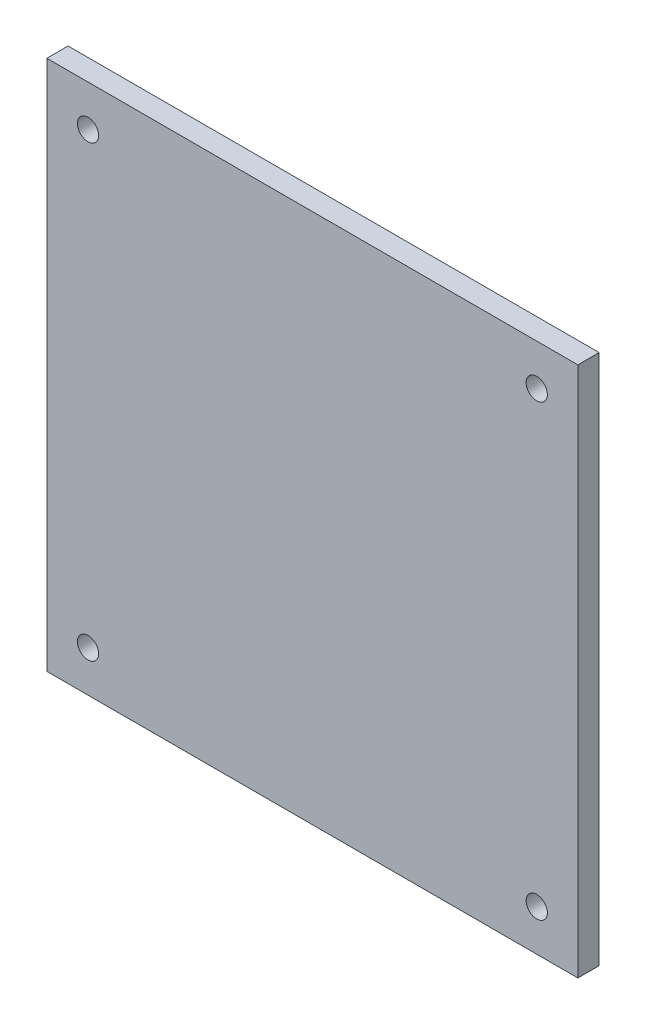
ISO-10303-21;
HEADER;
FILE_DESCRIPTION(('STEP AP214'),'2;1');
FILE_NAME('part.step','',(''),(''),'','','');
FILE_SCHEMA(('AUTOMOTIVE_DESIGN { 1 0 10303 214 1 1 1 1 }'));
ENDSEC;
DATA;
#1=APPLICATION_CONTEXT('core data for automotive mechanical design processes');
#2=APPLICATION_PROTOCOL_DEFINITION('international standard','automotive_design',2000,#1);
#3=PRODUCT_CONTEXT('',#1,'mechanical');
#4=PRODUCT('Part','Part','',(#3));
#5=PRODUCT_RELATED_PRODUCT_CATEGORY('part','',(#4));
#6=PRODUCT_DEFINITION_FORMATION('','',#4);
#7=PRODUCT_DEFINITION_CONTEXT('part definition',#1,'design');
#8=PRODUCT_DEFINITION('design','',#6,#7);
#9=PRODUCT_DEFINITION_SHAPE('','',#8);
#10=(LENGTH_UNIT() NAMED_UNIT(*) SI_UNIT(.MILLI.,.METRE.));
#11=(NAMED_UNIT(*) PLANE_ANGLE_UNIT() SI_UNIT($,.RADIAN.));
#12=(NAMED_UNIT(*) SI_UNIT($,.STERADIAN.) SOLID_ANGLE_UNIT());
#13=UNCERTAINTY_MEASURE_WITH_UNIT(LENGTH_MEASURE(1.E-05),#10,'distance_accuracy_value','');
#14=(GEOMETRIC_REPRESENTATION_CONTEXT(3) GLOBAL_UNCERTAINTY_ASSIGNED_CONTEXT((#13)) GLOBAL_UNIT_ASSIGNED_CONTEXT((#10,
#11,#12)) REPRESENTATION_CONTEXT('',''));
#15=CARTESIAN_POINT('',(0.,0.,0.));
#16=DIRECTION('',(0.,0.,1.));
#17=DIRECTION('',(1.,0.,0.));
#18=AXIS2_PLACEMENT_3D('',#15,#16,#17);
#19=CARTESIAN_POINT('',(105.866052122331,1.22834426278652,-4.));
#20=DIRECTION('',(-1.,0.,0.));
#21=DIRECTION('',(0.,0.,1.));
#22=AXIS2_PLACEMENT_3D('',#19,#20,#21);
#23=PLANE('',#22);
#24=DIRECTION('',(0.,-1.,0.));
#25=VECTOR('',#24,1.);
#26=CARTESIAN_POINT('',(105.866052122331,1.22834426278652,0.));
#27=LINE('',#26,#25);
#28=CARTESIAN_POINT('',(105.866052122331,101.228344262787,0.));
#29=VERTEX_POINT('',#28);
#30=CARTESIAN_POINT('',(105.866052122331,1.22834426278652,0.));
#31=VERTEX_POINT('',#30);
#32=EDGE_CURVE('E107',#29,#31,#27,.T.);
#33=ORIENTED_EDGE('',*,*,#32,.F.);
#34=DIRECTION('',(0.,0.,1.));
#35=VECTOR('',#34,1.);
#36=CARTESIAN_POINT('',(105.866052122331,101.228344262787,-4.));
#37=LINE('',#36,#35);
#38=CARTESIAN_POINT('',(105.866052122331,101.228344262787,-4.));
#39=VERTEX_POINT('',#38);
#40=EDGE_CURVE('E11',#39,#29,#37,.T.);
#41=ORIENTED_EDGE('',*,*,#40,.F.);
#42=DIRECTION('',(0.,-1.,0.));
#43=VECTOR('',#42,1.);
#44=CARTESIAN_POINT('',(105.866052122331,1.22834426278652,-4.));
#45=LINE('',#44,#43);
#46=CARTESIAN_POINT('',(105.866052122331,1.22834426278652,-4.));
#47=VERTEX_POINT('',#46);
#48=EDGE_CURVE('E100',#39,#47,#45,.T.);
#49=ORIENTED_EDGE('',*,*,#48,.T.);
#50=DIRECTION('',(0.,0.,1.));
#51=VECTOR('',#50,1.);
#52=CARTESIAN_POINT('',(105.866052122331,1.22834426278652,-4.));
#53=LINE('',#52,#51);
#54=EDGE_CURVE('E45',#47,#31,#53,.T.);
#55=ORIENTED_EDGE('',*,*,#54,.T.);
#56=EDGE_LOOP('',(#33,#41,#49,#55));
#57=FACE_BOUND('',#56,.T.);
#58=ADVANCED_FACE('F42',(#57),#23,.T.);
#59=CARTESIAN_POINT('',(105.866052122331,101.228344262787,-4.));
#60=DIRECTION('',(0.,1.,0.));
#61=DIRECTION('',(0.,0.,1.));
#62=AXIS2_PLACEMENT_3D('',#59,#60,#61);
#63=PLANE('',#62);
#64=DIRECTION('',(-1.,0.,0.));
#65=VECTOR('',#64,1.);
#66=CARTESIAN_POINT('',(105.866052122331,101.228344262787,0.));
#67=LINE('',#66,#65);
#68=CARTESIAN_POINT('',(205.866052122331,101.228344262787,0.));
#69=VERTEX_POINT('',#68);
#70=EDGE_CURVE('E102',#69,#29,#67,.T.);
#71=ORIENTED_EDGE('',*,*,#70,.F.);
#72=DIRECTION('',(0.,0.,1.));
#73=VECTOR('',#72,1.);
#74=CARTESIAN_POINT('',(205.866052122331,101.228344262787,-4.));
#75=LINE('',#74,#73);
#76=CARTESIAN_POINT('',(205.866052122331,101.228344262787,-4.));
#77=VERTEX_POINT('',#76);
#78=EDGE_CURVE('E51',#77,#69,#75,.T.);
#79=ORIENTED_EDGE('',*,*,#78,.F.);
#80=DIRECTION('',(-1.,0.,0.));
#81=VECTOR('',#80,1.);
#82=CARTESIAN_POINT('',(105.866052122331,101.228344262787,-4.));
#83=LINE('',#82,#81);
#84=EDGE_CURVE('E97',#77,#39,#83,.T.);
#85=ORIENTED_EDGE('',*,*,#84,.T.);
#86=ORIENTED_EDGE('',*,*,#40,.T.);
#87=EDGE_LOOP('',(#71,#79,#85,#86));
#88=FACE_BOUND('',#87,.T.);
#89=ADVANCED_FACE('F118',(#88),#63,.T.);
#90=CARTESIAN_POINT('',(205.866052122331,1.22834426278652,-4.));
#91=DIRECTION('',(1.,0.,0.));
#92=DIRECTION('',(0.,0.,-1.));
#93=AXIS2_PLACEMENT_3D('',#90,#91,#92);
#94=PLANE('',#93);
#95=DIRECTION('',(0.,1.,0.));
#96=VECTOR('',#95,1.);
#97=CARTESIAN_POINT('',(205.866052122331,1.22834426278652,0.));
#98=LINE('',#97,#96);
#99=CARTESIAN_POINT('',(205.866052122331,1.22834426278652,0.));
#100=VERTEX_POINT('',#99);
#101=EDGE_CURVE('E92',#100,#69,#98,.T.);
#102=ORIENTED_EDGE('',*,*,#101,.F.);
#103=DIRECTION('',(0.,0.,1.));
#104=VECTOR('',#103,1.);
#105=CARTESIAN_POINT('',(205.866052122331,1.22834426278652,-4.));
#106=LINE('',#105,#104);
#107=CARTESIAN_POINT('',(205.866052122331,1.22834426278652,-4.));
#108=VERTEX_POINT('',#107);
#109=EDGE_CURVE('E87',#108,#100,#106,.T.);
#110=ORIENTED_EDGE('',*,*,#109,.F.);
#111=DIRECTION('',(0.,1.,0.));
#112=VECTOR('',#111,1.);
#113=CARTESIAN_POINT('',(205.866052122331,1.22834426278652,-4.));
#114=LINE('',#113,#112);
#115=EDGE_CURVE('E90',#108,#77,#114,.T.);
#116=ORIENTED_EDGE('',*,*,#115,.T.);
#117=ORIENTED_EDGE('',*,*,#78,.T.);
#118=EDGE_LOOP('',(#102,#110,#116,#117));
#119=FACE_BOUND('',#118,.T.);
#120=ADVANCED_FACE('F89',(#119),#94,.T.);
#121=CARTESIAN_POINT('',(105.866052122331,1.22834426278652,-4.));
#122=DIRECTION('',(0.,-1.,0.));
#123=DIRECTION('',(0.,0.,-1.));
#124=AXIS2_PLACEMENT_3D('',#121,#122,#123);
#125=PLANE('',#124);
#126=DIRECTION('',(1.,0.,0.));
#127=VECTOR('',#126,1.);
#128=CARTESIAN_POINT('',(105.866052122331,1.22834426278652,0.));
#129=LINE('',#128,#127);
#130=EDGE_CURVE('E110',#31,#100,#129,.T.);
#131=ORIENTED_EDGE('',*,*,#130,.F.);
#132=ORIENTED_EDGE('',*,*,#54,.F.);
#133=DIRECTION('',(1.,0.,0.));
#134=VECTOR('',#133,1.);
#135=CARTESIAN_POINT('',(105.866052122331,1.22834426278652,-4.));
#136=LINE('',#135,#134);
#137=EDGE_CURVE('E96',#47,#108,#136,.T.);
#138=ORIENTED_EDGE('',*,*,#137,.T.);
#139=ORIENTED_EDGE('',*,*,#109,.T.);
#140=EDGE_LOOP('',(#131,#132,#138,#139));
#141=FACE_BOUND('',#140,.T.);
#142=ADVANCED_FACE('F99',(#141),#125,.T.);
#143=CARTESIAN_POINT('',(0.,0.,-4.));
#144=DIRECTION('',(0.,0.,-1.));
#145=DIRECTION('',(-1.,0.,0.));
#146=AXIS2_PLACEMENT_3D('',#143,#144,#145);
#147=PLANE('',#146);
#148=CARTESIAN_POINT('',(113.616052122331,8.97834426278652,-4.));
#149=DIRECTION('',(0.,0.,1.));
#150=DIRECTION('',(1.,0.,0.));
#151=AXIS2_PLACEMENT_3D('',#148,#149,#150);
#152=CIRCLE('',#151,2.);
#153=CARTESIAN_POINT('',(115.616052122331,8.97834426278652,-4.));
#154=VERTEX_POINT('',#153);
#155=EDGE_CURVE('E159',#154,#154,#152,.T.);
#156=ORIENTED_EDGE('',*,*,#155,.T.);
#157=EDGE_LOOP('',(#156));
#158=FACE_BOUND('',#157,.T.);
#159=CARTESIAN_POINT('',(198.116052122331,8.97834426278652,-4.));
#160=DIRECTION('',(0.,0.,1.));
#161=DIRECTION('',(1.,0.,0.));
#162=AXIS2_PLACEMENT_3D('',#159,#160,#161);
#163=CIRCLE('',#162,2.);
#164=CARTESIAN_POINT('',(200.116052122331,8.97834426278652,-4.));
#165=VERTEX_POINT('',#164);
#166=EDGE_CURVE('E167',#165,#165,#163,.T.);
#167=ORIENTED_EDGE('',*,*,#166,.T.);
#168=EDGE_LOOP('',(#167));
#169=FACE_BOUND('',#168,.T.);
#170=CARTESIAN_POINT('',(198.116052122331,93.4783442627865,-4.));
#171=DIRECTION('',(0.,0.,1.));
#172=DIRECTION('',(1.,0.,0.));
#173=AXIS2_PLACEMENT_3D('',#170,#171,#172);
#174=CIRCLE('',#173,2.);
#175=CARTESIAN_POINT('',(200.116052122331,93.4783442627865,-4.));
#176=VERTEX_POINT('',#175);
#177=EDGE_CURVE('E173',#176,#176,#174,.T.);
#178=ORIENTED_EDGE('',*,*,#177,.T.);
#179=EDGE_LOOP('',(#178));
#180=FACE_BOUND('',#179,.T.);
#181=CARTESIAN_POINT('',(113.616052122331,93.4783442627865,-4.));
#182=DIRECTION('',(0.,0.,1.));
#183=DIRECTION('',(1.,0.,0.));
#184=AXIS2_PLACEMENT_3D('',#181,#182,#183);
#185=CIRCLE('',#184,2.);
#186=CARTESIAN_POINT('',(115.616052122331,93.4783442627865,-4.));
#187=VERTEX_POINT('',#186);
#188=EDGE_CURVE('E111',#187,#187,#185,.T.);
#189=ORIENTED_EDGE('',*,*,#188,.T.);
#190=EDGE_LOOP('',(#189));
#191=FACE_BOUND('',#190,.T.);
#192=ORIENTED_EDGE('',*,*,#48,.F.);
#193=ORIENTED_EDGE('',*,*,#84,.F.);
#194=ORIENTED_EDGE('',*,*,#115,.F.);
#195=ORIENTED_EDGE('',*,*,#137,.F.);
#196=EDGE_LOOP('',(#192,#193,#194,#195));
#197=FACE_BOUND('',#196,.T.);
#198=ADVANCED_FACE('F95',(#158,#169,#180,#191,#197),#147,.T.);
#199=CARTESIAN_POINT('',(0.,0.,0.));
#200=DIRECTION('',(0.,0.,-1.));
#201=DIRECTION('',(-1.,0.,0.));
#202=AXIS2_PLACEMENT_3D('',#199,#200,#201);
#203=PLANE('',#202);
#204=CARTESIAN_POINT('',(113.616052122331,8.97834426278652,0.));
#205=DIRECTION('',(0.,0.,1.));
#206=DIRECTION('',(1.,0.,0.));
#207=AXIS2_PLACEMENT_3D('',#204,#205,#206);
#208=CIRCLE('',#207,2.);
#209=CARTESIAN_POINT('',(115.616052122331,8.97834426278652,0.));
#210=VERTEX_POINT('',#209);
#211=EDGE_CURVE('E162',#210,#210,#208,.T.);
#212=ORIENTED_EDGE('',*,*,#211,.F.);
#213=EDGE_LOOP('',(#212));
#214=FACE_BOUND('',#213,.T.);
#215=CARTESIAN_POINT('',(198.116052122331,8.97834426278652,0.));
#216=DIRECTION('',(0.,0.,1.));
#217=DIRECTION('',(1.,0.,0.));
#218=AXIS2_PLACEMENT_3D('',#215,#216,#217);
#219=CIRCLE('',#218,2.);
#220=CARTESIAN_POINT('',(200.116052122331,8.97834426278652,0.));
#221=VERTEX_POINT('',#220);
#222=EDGE_CURVE('E164',#221,#221,#219,.T.);
#223=ORIENTED_EDGE('',*,*,#222,.F.);
#224=EDGE_LOOP('',(#223));
#225=FACE_BOUND('',#224,.T.);
#226=CARTESIAN_POINT('',(198.116052122331,93.4783442627865,0.));
#227=DIRECTION('',(0.,0.,1.));
#228=DIRECTION('',(1.,0.,0.));
#229=AXIS2_PLACEMENT_3D('',#226,#227,#228);
#230=CIRCLE('',#229,2.);
#231=CARTESIAN_POINT('',(200.116052122331,93.4783442627865,0.));
#232=VERTEX_POINT('',#231);
#233=EDGE_CURVE('E170',#232,#232,#230,.T.);
#234=ORIENTED_EDGE('',*,*,#233,.F.);
#235=EDGE_LOOP('',(#234));
#236=FACE_BOUND('',#235,.T.);
#237=CARTESIAN_POINT('',(113.616052122331,93.4783442627865,0.));
#238=DIRECTION('',(0.,0.,1.));
#239=DIRECTION('',(1.,0.,0.));
#240=AXIS2_PLACEMENT_3D('',#237,#238,#239);
#241=CIRCLE('',#240,2.);
#242=CARTESIAN_POINT('',(115.616052122331,93.4783442627865,0.));
#243=VERTEX_POINT('',#242);
#244=EDGE_CURVE('E176',#243,#243,#241,.T.);
#245=ORIENTED_EDGE('',*,*,#244,.F.);
#246=EDGE_LOOP('',(#245));
#247=FACE_BOUND('',#246,.T.);
#248=ORIENTED_EDGE('',*,*,#32,.T.);
#249=ORIENTED_EDGE('',*,*,#130,.T.);
#250=ORIENTED_EDGE('',*,*,#101,.T.);
#251=ORIENTED_EDGE('',*,*,#70,.T.);
#252=EDGE_LOOP('',(#248,#249,#250,#251));
#253=FACE_BOUND('',#252,.T.);
#254=ADVANCED_FACE('F117',(#214,#225,#236,#247,#253),#203,.F.);
#255=CARTESIAN_POINT('',(113.616052122331,93.4783442627865,-4.));
#256=DIRECTION('',(0.,0.,1.));
#257=DIRECTION('',(1.,0.,0.));
#258=AXIS2_PLACEMENT_3D('',#255,#256,#257);
#259=CYLINDRICAL_SURFACE('',#258,2.);
#260=ORIENTED_EDGE('',*,*,#188,.F.);
#261=EDGE_LOOP('',(#260));
#262=FACE_BOUND('',#261,.T.);
#263=ORIENTED_EDGE('',*,*,#244,.T.);
#264=EDGE_LOOP('',(#263));
#265=FACE_BOUND('',#264,.T.);
#266=ADVANCED_FACE('F136',(#262,#265),#259,.F.);
#267=CARTESIAN_POINT('',(198.116052122331,93.4783442627865,-4.));
#268=DIRECTION('',(0.,0.,1.));
#269=DIRECTION('',(1.,0.,0.));
#270=AXIS2_PLACEMENT_3D('',#267,#268,#269);
#271=CYLINDRICAL_SURFACE('',#270,2.);
#272=ORIENTED_EDGE('',*,*,#177,.F.);
#273=EDGE_LOOP('',(#272));
#274=FACE_BOUND('',#273,.T.);
#275=ORIENTED_EDGE('',*,*,#233,.T.);
#276=EDGE_LOOP('',(#275));
#277=FACE_BOUND('',#276,.T.);
#278=ADVANCED_FACE('F143',(#274,#277),#271,.F.);
#279=CARTESIAN_POINT('',(198.116052122331,8.97834426278652,-4.));
#280=DIRECTION('',(0.,0.,1.));
#281=DIRECTION('',(1.,0.,0.));
#282=AXIS2_PLACEMENT_3D('',#279,#280,#281);
#283=CYLINDRICAL_SURFACE('',#282,2.);
#284=ORIENTED_EDGE('',*,*,#166,.F.);
#285=EDGE_LOOP('',(#284));
#286=FACE_BOUND('',#285,.T.);
#287=ORIENTED_EDGE('',*,*,#222,.T.);
#288=EDGE_LOOP('',(#287));
#289=FACE_BOUND('',#288,.T.);
#290=ADVANCED_FACE('F147',(#286,#289),#283,.F.);
#291=CARTESIAN_POINT('',(113.616052122331,8.97834426278652,-4.));
#292=DIRECTION('',(0.,0.,1.));
#293=DIRECTION('',(1.,0.,0.));
#294=AXIS2_PLACEMENT_3D('',#291,#292,#293);
#295=CYLINDRICAL_SURFACE('',#294,2.);
#296=ORIENTED_EDGE('',*,*,#155,.F.);
#297=EDGE_LOOP('',(#296));
#298=FACE_BOUND('',#297,.T.);
#299=ORIENTED_EDGE('',*,*,#211,.T.);
#300=EDGE_LOOP('',(#299));
#301=FACE_BOUND('',#300,.T.);
#302=ADVANCED_FACE('F151',(#298,#301),#295,.F.);
#303=CLOSED_SHELL('',(#58,#89,#120,#142,#198,#254,#266,#278,#290,#302));
#304=MANIFOLD_SOLID_BREP('B2',#303);
#305=ADVANCED_BREP_SHAPE_REPRESENTATION('',(#18,#304),#14);
#306=SHAPE_DEFINITION_REPRESENTATION(#9,#305);
ENDSEC;
END-ISO-10303-21;
